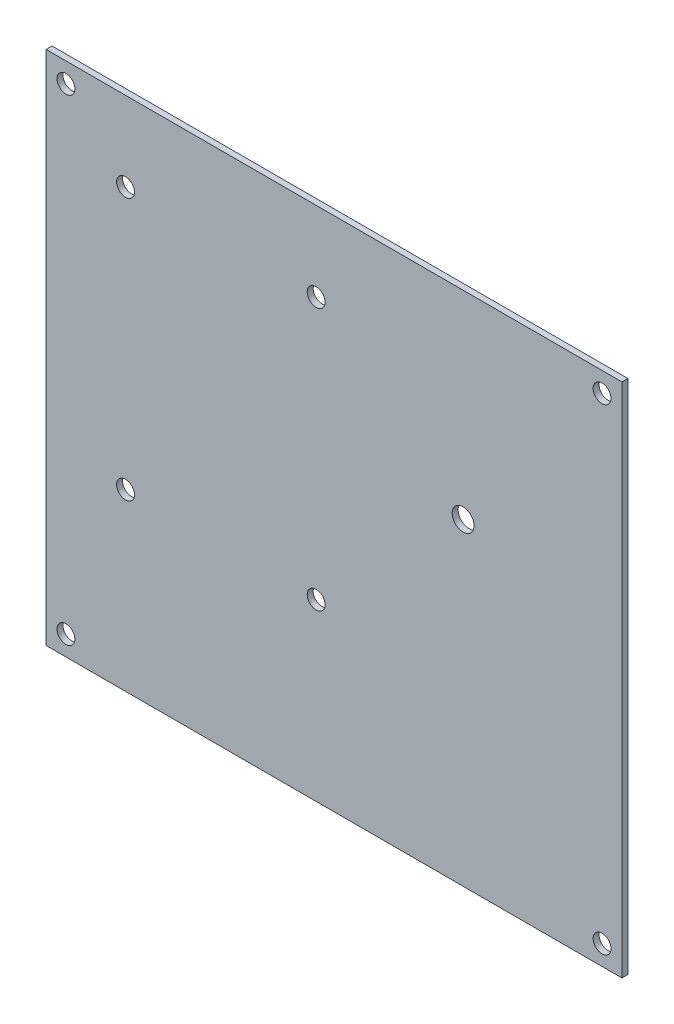
ISO-10303-21;
HEADER;
FILE_DESCRIPTION(('STEP AP214'),'2;1');
FILE_NAME('part.step','',(''),(''),'','','');
FILE_SCHEMA(('AUTOMOTIVE_DESIGN { 1 0 10303 214 1 1 1 1 }'));
ENDSEC;
DATA;
#1=APPLICATION_CONTEXT('core data for automotive mechanical design processes');
#2=APPLICATION_PROTOCOL_DEFINITION('international standard','automotive_design',2000,#1);
#3=PRODUCT_CONTEXT('',#1,'mechanical');
#4=PRODUCT('Part','Part','',(#3));
#5=PRODUCT_RELATED_PRODUCT_CATEGORY('part','',(#4));
#6=PRODUCT_DEFINITION_FORMATION('','',#4);
#7=PRODUCT_DEFINITION_CONTEXT('part definition',#1,'design');
#8=PRODUCT_DEFINITION('design','',#6,#7);
#9=PRODUCT_DEFINITION_SHAPE('','',#8);
#10=(LENGTH_UNIT() NAMED_UNIT(*) SI_UNIT(.MILLI.,.METRE.));
#11=(NAMED_UNIT(*) PLANE_ANGLE_UNIT() SI_UNIT($,.RADIAN.));
#12=(NAMED_UNIT(*) SI_UNIT($,.STERADIAN.) SOLID_ANGLE_UNIT());
#13=UNCERTAINTY_MEASURE_WITH_UNIT(LENGTH_MEASURE(1.E-05),#10,'distance_accuracy_value','');
#14=(GEOMETRIC_REPRESENTATION_CONTEXT(3) GLOBAL_UNCERTAINTY_ASSIGNED_CONTEXT((#13)) GLOBAL_UNIT_ASSIGNED_CONTEXT((#10,
#11,#12)) REPRESENTATION_CONTEXT('',''));
#15=CARTESIAN_POINT('',(0.,0.,0.));
#16=DIRECTION('',(0.,0.,1.));
#17=DIRECTION('',(1.,0.,0.));
#18=AXIS2_PLACEMENT_3D('',#15,#16,#17);
#19=CARTESIAN_POINT('',(-72.5,-65.,1.5));
#20=DIRECTION('',(0.,0.,-1.));
#21=DIRECTION('',(-1.,0.,0.));
#22=AXIS2_PLACEMENT_3D('',#19,#20,#21);
#23=PLANE('',#22);
#24=CARTESIAN_POINT('',(-4.49999999999998,-21.,1.5));
#25=DIRECTION('',(0.,0.,1.));
#26=DIRECTION('',(-1.,0.,0.));
#27=AXIS2_PLACEMENT_3D('',#24,#25,#26);
#28=CIRCLE('',#27,2.25);
#29=CARTESIAN_POINT('',(-6.74999999999997,-21.,1.5));
#30=VERTEX_POINT('',#29);
#31=EDGE_CURVE('E150',#30,#30,#28,.T.);
#32=ORIENTED_EDGE('',*,*,#31,.F.);
#33=EDGE_LOOP('',(#32));
#34=FACE_BOUND('',#33,.T.);
#35=CARTESIAN_POINT('',(-52.5,-21.,1.5));
#36=DIRECTION('',(0.,0.,1.));
#37=DIRECTION('',(-1.,0.,0.));
#38=AXIS2_PLACEMENT_3D('',#35,#36,#37);
#39=CIRCLE('',#38,2.25);
#40=CARTESIAN_POINT('',(-54.75,-21.,1.5));
#41=VERTEX_POINT('',#40);
#42=EDGE_CURVE('E138',#41,#41,#39,.T.);
#43=ORIENTED_EDGE('',*,*,#42,.F.);
#44=EDGE_LOOP('',(#43));
#45=FACE_BOUND('',#44,.T.);
#46=CARTESIAN_POINT('',(67.5,60.,1.5));
#47=DIRECTION('',(0.,0.,1.));
#48=DIRECTION('',(-1.,0.,0.));
#49=AXIS2_PLACEMENT_3D('',#46,#47,#48);
#50=CIRCLE('',#49,2.25);
#51=CARTESIAN_POINT('',(65.25,60.,1.5));
#52=VERTEX_POINT('',#51);
#53=EDGE_CURVE('E126',#52,#52,#50,.T.);
#54=ORIENTED_EDGE('',*,*,#53,.F.);
#55=EDGE_LOOP('',(#54));
#56=FACE_BOUND('',#55,.T.);
#57=CARTESIAN_POINT('',(-67.5,-60.,1.5));
#58=DIRECTION('',(0.,0.,1.));
#59=DIRECTION('',(-1.,0.,0.));
#60=AXIS2_PLACEMENT_3D('',#57,#58,#59);
#61=CIRCLE('',#60,2.25);
#62=CARTESIAN_POINT('',(-69.75,-60.,1.5));
#63=VERTEX_POINT('',#62);
#64=EDGE_CURVE('E114',#63,#63,#61,.T.);
#65=ORIENTED_EDGE('',*,*,#64,.F.);
#66=EDGE_LOOP('',(#65));
#67=FACE_BOUND('',#66,.T.);
#68=DIRECTION('',(0.,-1.,0.));
#69=VECTOR('',#68,1.);
#70=CARTESIAN_POINT('',(-72.5,-65.,1.5));
#71=LINE('',#70,#69);
#72=CARTESIAN_POINT('',(-72.5,65.,1.5));
#73=VERTEX_POINT('',#72);
#74=CARTESIAN_POINT('',(-72.5,-65.,1.5));
#75=VERTEX_POINT('',#74);
#76=EDGE_CURVE('E84',#73,#75,#71,.T.);
#77=ORIENTED_EDGE('',*,*,#76,.T.);
#78=DIRECTION('',(1.,0.,0.));
#79=VECTOR('',#78,1.);
#80=CARTESIAN_POINT('',(-72.5,-65.,1.5));
#81=LINE('',#80,#79);
#82=CARTESIAN_POINT('',(72.5,-65.,1.5));
#83=VERTEX_POINT('',#82);
#84=EDGE_CURVE('E79',#75,#83,#81,.T.);
#85=ORIENTED_EDGE('',*,*,#84,.T.);
#86=DIRECTION('',(0.,1.,0.));
#87=VECTOR('',#86,1.);
#88=CARTESIAN_POINT('',(72.5,-65.,1.5));
#89=LINE('',#88,#87);
#90=CARTESIAN_POINT('',(72.5,65.,1.5));
#91=VERTEX_POINT('',#90);
#92=EDGE_CURVE('E82',#83,#91,#89,.T.);
#93=ORIENTED_EDGE('',*,*,#92,.T.);
#94=DIRECTION('',(-1.,0.,0.));
#95=VECTOR('',#94,1.);
#96=CARTESIAN_POINT('',(-72.5,65.,1.5));
#97=LINE('',#96,#95);
#98=EDGE_CURVE('E49',#91,#73,#97,.T.);
#99=ORIENTED_EDGE('',*,*,#98,.T.);
#100=EDGE_LOOP('',(#77,#85,#93,#99));
#101=FACE_BOUND('',#100,.T.);
#102=CARTESIAN_POINT('',(-67.5,60.,1.5));
#103=DIRECTION('',(0.,0.,1.));
#104=DIRECTION('',(1.,0.,0.));
#105=AXIS2_PLACEMENT_3D('',#102,#103,#104);
#106=CIRCLE('',#105,2.25);
#107=CARTESIAN_POINT('',(-65.25,60.,1.5));
#108=VERTEX_POINT('',#107);
#109=EDGE_CURVE('E99',#108,#108,#106,.T.);
#110=ORIENTED_EDGE('',*,*,#109,.F.);
#111=EDGE_LOOP('',(#110));
#112=FACE_BOUND('',#111,.T.);
#113=CARTESIAN_POINT('',(67.5,-60.,1.5));
#114=DIRECTION('',(0.,0.,1.));
#115=DIRECTION('',(1.,0.,0.));
#116=AXIS2_PLACEMENT_3D('',#113,#114,#115);
#117=CIRCLE('',#116,2.25);
#118=CARTESIAN_POINT('',(69.75,-60.,1.5));
#119=VERTEX_POINT('',#118);
#120=EDGE_CURVE('E120',#119,#119,#117,.T.);
#121=ORIENTED_EDGE('',*,*,#120,.F.);
#122=EDGE_LOOP('',(#121));
#123=FACE_BOUND('',#122,.T.);
#124=CARTESIAN_POINT('',(-52.5,45.,1.5));
#125=DIRECTION('',(0.,0.,1.));
#126=DIRECTION('',(1.,0.,0.));
#127=AXIS2_PLACEMENT_3D('',#124,#125,#126);
#128=CIRCLE('',#127,2.25);
#129=CARTESIAN_POINT('',(-50.25,45.,1.5));
#130=VERTEX_POINT('',#129);
#131=EDGE_CURVE('E132',#130,#130,#128,.T.);
#132=ORIENTED_EDGE('',*,*,#131,.F.);
#133=EDGE_LOOP('',(#132));
#134=FACE_BOUND('',#133,.T.);
#135=CARTESIAN_POINT('',(-4.49999999999998,45.,1.5));
#136=DIRECTION('',(0.,0.,1.));
#137=DIRECTION('',(1.,0.,0.));
#138=AXIS2_PLACEMENT_3D('',#135,#136,#137);
#139=CIRCLE('',#138,2.25);
#140=CARTESIAN_POINT('',(-2.24999999999998,45.,1.5));
#141=VERTEX_POINT('',#140);
#142=EDGE_CURVE('E144',#141,#141,#139,.T.);
#143=ORIENTED_EDGE('',*,*,#142,.F.);
#144=EDGE_LOOP('',(#143));
#145=FACE_BOUND('',#144,.T.);
#146=CARTESIAN_POINT('',(32.5,15.,1.5));
#147=DIRECTION('',(0.,0.,1.));
#148=DIRECTION('',(1.,0.,0.));
#149=AXIS2_PLACEMENT_3D('',#146,#147,#148);
#150=CIRCLE('',#149,2.75);
#151=CARTESIAN_POINT('',(35.25,15.,1.5));
#152=VERTEX_POINT('',#151);
#153=EDGE_CURVE('E156',#152,#152,#150,.T.);
#154=ORIENTED_EDGE('',*,*,#153,.F.);
#155=EDGE_LOOP('',(#154));
#156=FACE_BOUND('',#155,.T.);
#157=ADVANCED_FACE('F32',(#34,#45,#56,#67,#101,#112,#123,#134,#145,#156),#23,.F.);
#158=CARTESIAN_POINT('',(-72.5,-65.,0.));
#159=DIRECTION('',(0.,0.,-1.));
#160=DIRECTION('',(-1.,0.,0.));
#161=AXIS2_PLACEMENT_3D('',#158,#159,#160);
#162=PLANE('',#161);
#163=CARTESIAN_POINT('',(-4.49999999999998,-21.,0.));
#164=DIRECTION('',(0.,0.,1.));
#165=DIRECTION('',(-1.,0.,0.));
#166=AXIS2_PLACEMENT_3D('',#163,#164,#165);
#167=CIRCLE('',#166,2.25);
#168=CARTESIAN_POINT('',(-6.74999999999997,-21.,0.));
#169=VERTEX_POINT('',#168);
#170=EDGE_CURVE('E153',#169,#169,#167,.T.);
#171=ORIENTED_EDGE('',*,*,#170,.T.);
#172=EDGE_LOOP('',(#171));
#173=FACE_BOUND('',#172,.T.);
#174=CARTESIAN_POINT('',(-52.5,-21.,0.));
#175=DIRECTION('',(0.,0.,1.));
#176=DIRECTION('',(-1.,0.,0.));
#177=AXIS2_PLACEMENT_3D('',#174,#175,#176);
#178=CIRCLE('',#177,2.25);
#179=CARTESIAN_POINT('',(-54.75,-21.,0.));
#180=VERTEX_POINT('',#179);
#181=EDGE_CURVE('E141',#180,#180,#178,.T.);
#182=ORIENTED_EDGE('',*,*,#181,.T.);
#183=EDGE_LOOP('',(#182));
#184=FACE_BOUND('',#183,.T.);
#185=CARTESIAN_POINT('',(67.5,60.,0.));
#186=DIRECTION('',(0.,0.,1.));
#187=DIRECTION('',(-1.,0.,0.));
#188=AXIS2_PLACEMENT_3D('',#185,#186,#187);
#189=CIRCLE('',#188,2.25);
#190=CARTESIAN_POINT('',(65.25,60.,0.));
#191=VERTEX_POINT('',#190);
#192=EDGE_CURVE('E129',#191,#191,#189,.T.);
#193=ORIENTED_EDGE('',*,*,#192,.T.);
#194=EDGE_LOOP('',(#193));
#195=FACE_BOUND('',#194,.T.);
#196=CARTESIAN_POINT('',(-67.5,-60.,0.));
#197=DIRECTION('',(0.,0.,1.));
#198=DIRECTION('',(-1.,0.,0.));
#199=AXIS2_PLACEMENT_3D('',#196,#197,#198);
#200=CIRCLE('',#199,2.25);
#201=CARTESIAN_POINT('',(-69.75,-60.,0.));
#202=VERTEX_POINT('',#201);
#203=EDGE_CURVE('E117',#202,#202,#200,.T.);
#204=ORIENTED_EDGE('',*,*,#203,.T.);
#205=EDGE_LOOP('',(#204));
#206=FACE_BOUND('',#205,.T.);
#207=DIRECTION('',(0.,-1.,0.));
#208=VECTOR('',#207,1.);
#209=CARTESIAN_POINT('',(-72.5,-65.,0.));
#210=LINE('',#209,#208);
#211=CARTESIAN_POINT('',(-72.5,65.,0.));
#212=VERTEX_POINT('',#211);
#213=CARTESIAN_POINT('',(-72.5,-65.,0.));
#214=VERTEX_POINT('',#213);
#215=EDGE_CURVE('E96',#212,#214,#210,.T.);
#216=ORIENTED_EDGE('',*,*,#215,.F.);
#217=DIRECTION('',(-1.,0.,0.));
#218=VECTOR('',#217,1.);
#219=CARTESIAN_POINT('',(-72.5,65.,0.));
#220=LINE('',#219,#218);
#221=CARTESIAN_POINT('',(72.5,65.,0.));
#222=VERTEX_POINT('',#221);
#223=EDGE_CURVE('E72',#222,#212,#220,.T.);
#224=ORIENTED_EDGE('',*,*,#223,.F.);
#225=DIRECTION('',(0.,1.,0.));
#226=VECTOR('',#225,1.);
#227=CARTESIAN_POINT('',(72.5,-65.,0.));
#228=LINE('',#227,#226);
#229=CARTESIAN_POINT('',(72.5,-65.,0.));
#230=VERTEX_POINT('',#229);
#231=EDGE_CURVE('E66',#230,#222,#228,.T.);
#232=ORIENTED_EDGE('',*,*,#231,.F.);
#233=DIRECTION('',(1.,0.,0.));
#234=VECTOR('',#233,1.);
#235=CARTESIAN_POINT('',(-72.5,-65.,0.));
#236=LINE('',#235,#234);
#237=EDGE_CURVE('E88',#214,#230,#236,.T.);
#238=ORIENTED_EDGE('',*,*,#237,.F.);
#239=EDGE_LOOP('',(#216,#224,#232,#238));
#240=FACE_BOUND('',#239,.T.);
#241=CARTESIAN_POINT('',(-67.5,60.,0.));
#242=DIRECTION('',(0.,0.,1.));
#243=DIRECTION('',(1.,0.,0.));
#244=AXIS2_PLACEMENT_3D('',#241,#242,#243);
#245=CIRCLE('',#244,2.25);
#246=CARTESIAN_POINT('',(-65.25,60.,0.));
#247=VERTEX_POINT('',#246);
#248=EDGE_CURVE('E111',#247,#247,#245,.T.);
#249=ORIENTED_EDGE('',*,*,#248,.T.);
#250=EDGE_LOOP('',(#249));
#251=FACE_BOUND('',#250,.T.);
#252=CARTESIAN_POINT('',(67.5,-60.,0.));
#253=DIRECTION('',(0.,0.,1.));
#254=DIRECTION('',(1.,0.,0.));
#255=AXIS2_PLACEMENT_3D('',#252,#253,#254);
#256=CIRCLE('',#255,2.25);
#257=CARTESIAN_POINT('',(69.75,-60.,0.));
#258=VERTEX_POINT('',#257);
#259=EDGE_CURVE('E123',#258,#258,#256,.T.);
#260=ORIENTED_EDGE('',*,*,#259,.T.);
#261=EDGE_LOOP('',(#260));
#262=FACE_BOUND('',#261,.T.);
#263=CARTESIAN_POINT('',(-52.5,45.,0.));
#264=DIRECTION('',(0.,0.,1.));
#265=DIRECTION('',(1.,0.,0.));
#266=AXIS2_PLACEMENT_3D('',#263,#264,#265);
#267=CIRCLE('',#266,2.25);
#268=CARTESIAN_POINT('',(-50.25,45.,0.));
#269=VERTEX_POINT('',#268);
#270=EDGE_CURVE('E135',#269,#269,#267,.T.);
#271=ORIENTED_EDGE('',*,*,#270,.T.);
#272=EDGE_LOOP('',(#271));
#273=FACE_BOUND('',#272,.T.);
#274=CARTESIAN_POINT('',(-4.49999999999998,45.,0.));
#275=DIRECTION('',(0.,0.,1.));
#276=DIRECTION('',(1.,0.,0.));
#277=AXIS2_PLACEMENT_3D('',#274,#275,#276);
#278=CIRCLE('',#277,2.25);
#279=CARTESIAN_POINT('',(-2.24999999999998,45.,0.));
#280=VERTEX_POINT('',#279);
#281=EDGE_CURVE('E147',#280,#280,#278,.T.);
#282=ORIENTED_EDGE('',*,*,#281,.T.);
#283=EDGE_LOOP('',(#282));
#284=FACE_BOUND('',#283,.T.);
#285=CARTESIAN_POINT('',(32.5,15.,0.));
#286=DIRECTION('',(0.,0.,1.));
#287=DIRECTION('',(1.,0.,0.));
#288=AXIS2_PLACEMENT_3D('',#285,#286,#287);
#289=CIRCLE('',#288,2.75);
#290=CARTESIAN_POINT('',(35.25,15.,0.));
#291=VERTEX_POINT('',#290);
#292=EDGE_CURVE('E159',#291,#291,#289,.T.);
#293=ORIENTED_EDGE('',*,*,#292,.T.);
#294=EDGE_LOOP('',(#293));
#295=FACE_BOUND('',#294,.T.);
#296=ADVANCED_FACE('F107',(#173,#184,#195,#206,#240,#251,#262,#273,#284,#295),#162,.T.);
#297=CARTESIAN_POINT('',(-72.5,-65.,1.5));
#298=DIRECTION('',(1.,0.,0.));
#299=DIRECTION('',(0.,1.,0.));
#300=AXIS2_PLACEMENT_3D('',#297,#298,#299);
#301=PLANE('',#300);
#302=ORIENTED_EDGE('',*,*,#215,.T.);
#303=DIRECTION('',(0.,0.,-1.));
#304=VECTOR('',#303,1.);
#305=CARTESIAN_POINT('',(-72.5,-65.,1.5));
#306=LINE('',#305,#304);
#307=EDGE_CURVE('E11',#75,#214,#306,.T.);
#308=ORIENTED_EDGE('',*,*,#307,.F.);
#309=ORIENTED_EDGE('',*,*,#76,.F.);
#310=DIRECTION('',(0.,0.,-1.));
#311=VECTOR('',#310,1.);
#312=CARTESIAN_POINT('',(-72.5,65.,1.5));
#313=LINE('',#312,#311);
#314=EDGE_CURVE('E92',#73,#212,#313,.T.);
#315=ORIENTED_EDGE('',*,*,#314,.T.);
#316=EDGE_LOOP('',(#302,#308,#309,#315));
#317=FACE_BOUND('',#316,.T.);
#318=ADVANCED_FACE('F34',(#317),#301,.F.);
#319=CARTESIAN_POINT('',(-72.5,-65.,1.5));
#320=DIRECTION('',(0.,1.,0.));
#321=DIRECTION('',(-1.,0.,0.));
#322=AXIS2_PLACEMENT_3D('',#319,#320,#321);
#323=PLANE('',#322);
#324=ORIENTED_EDGE('',*,*,#237,.T.);
#325=DIRECTION('',(0.,0.,-1.));
#326=VECTOR('',#325,1.);
#327=CARTESIAN_POINT('',(72.5,-65.,1.5));
#328=LINE('',#327,#326);
#329=EDGE_CURVE('E41',#83,#230,#328,.T.);
#330=ORIENTED_EDGE('',*,*,#329,.F.);
#331=ORIENTED_EDGE('',*,*,#84,.F.);
#332=ORIENTED_EDGE('',*,*,#307,.T.);
#333=EDGE_LOOP('',(#324,#330,#331,#332));
#334=FACE_BOUND('',#333,.T.);
#335=ADVANCED_FACE('F87',(#334),#323,.F.);
#336=CARTESIAN_POINT('',(72.5,-65.,1.5));
#337=DIRECTION('',(-1.,0.,0.));
#338=DIRECTION('',(0.,-1.,0.));
#339=AXIS2_PLACEMENT_3D('',#336,#337,#338);
#340=PLANE('',#339);
#341=ORIENTED_EDGE('',*,*,#231,.T.);
#342=DIRECTION('',(0.,0.,-1.));
#343=VECTOR('',#342,1.);
#344=CARTESIAN_POINT('',(72.5,65.,1.5));
#345=LINE('',#344,#343);
#346=EDGE_CURVE('E89',#91,#222,#345,.T.);
#347=ORIENTED_EDGE('',*,*,#346,.F.);
#348=ORIENTED_EDGE('',*,*,#92,.F.);
#349=ORIENTED_EDGE('',*,*,#329,.T.);
#350=EDGE_LOOP('',(#341,#347,#348,#349));
#351=FACE_BOUND('',#350,.T.);
#352=ADVANCED_FACE('F90',(#351),#340,.F.);
#353=CARTESIAN_POINT('',(-72.5,65.,1.5));
#354=DIRECTION('',(0.,-1.,0.));
#355=DIRECTION('',(0.,0.,-1.));
#356=AXIS2_PLACEMENT_3D('',#353,#354,#355);
#357=PLANE('',#356);
#358=ORIENTED_EDGE('',*,*,#223,.T.);
#359=ORIENTED_EDGE('',*,*,#314,.F.);
#360=ORIENTED_EDGE('',*,*,#98,.F.);
#361=ORIENTED_EDGE('',*,*,#346,.T.);
#362=EDGE_LOOP('',(#358,#359,#360,#361));
#363=FACE_BOUND('',#362,.T.);
#364=ADVANCED_FACE('F104',(#363),#357,.F.);
#365=CARTESIAN_POINT('',(-67.5,60.,1.5));
#366=DIRECTION('',(0.,0.,-1.));
#367=DIRECTION('',(-1.,0.,0.));
#368=AXIS2_PLACEMENT_3D('',#365,#366,#367);
#369=CYLINDRICAL_SURFACE('',#368,2.25);
#370=ORIENTED_EDGE('',*,*,#109,.T.);
#371=EDGE_LOOP('',(#370));
#372=FACE_BOUND('',#371,.T.);
#373=ORIENTED_EDGE('',*,*,#248,.F.);
#374=EDGE_LOOP('',(#373));
#375=FACE_BOUND('',#374,.T.);
#376=ADVANCED_FACE('F179',(#372,#375),#369,.F.);
#377=CARTESIAN_POINT('',(-67.5,-60.,1.5));
#378=DIRECTION('',(0.,0.,-1.));
#379=DIRECTION('',(-1.,0.,0.));
#380=AXIS2_PLACEMENT_3D('',#377,#378,#379);
#381=CYLINDRICAL_SURFACE('',#380,2.25);
#382=ORIENTED_EDGE('',*,*,#64,.T.);
#383=EDGE_LOOP('',(#382));
#384=FACE_BOUND('',#383,.T.);
#385=ORIENTED_EDGE('',*,*,#203,.F.);
#386=EDGE_LOOP('',(#385));
#387=FACE_BOUND('',#386,.T.);
#388=ADVANCED_FACE('F225',(#384,#387),#381,.F.);
#389=CARTESIAN_POINT('',(67.5,-60.,1.5));
#390=DIRECTION('',(0.,0.,-1.));
#391=DIRECTION('',(-1.,0.,0.));
#392=AXIS2_PLACEMENT_3D('',#389,#390,#391);
#393=CYLINDRICAL_SURFACE('',#392,2.25);
#394=ORIENTED_EDGE('',*,*,#120,.T.);
#395=EDGE_LOOP('',(#394));
#396=FACE_BOUND('',#395,.T.);
#397=ORIENTED_EDGE('',*,*,#259,.F.);
#398=EDGE_LOOP('',(#397));
#399=FACE_BOUND('',#398,.T.);
#400=ADVANCED_FACE('F233',(#396,#399),#393,.F.);
#401=CARTESIAN_POINT('',(67.5,60.,1.5));
#402=DIRECTION('',(0.,0.,-1.));
#403=DIRECTION('',(-1.,0.,0.));
#404=AXIS2_PLACEMENT_3D('',#401,#402,#403);
#405=CYLINDRICAL_SURFACE('',#404,2.25);
#406=ORIENTED_EDGE('',*,*,#53,.T.);
#407=EDGE_LOOP('',(#406));
#408=FACE_BOUND('',#407,.T.);
#409=ORIENTED_EDGE('',*,*,#192,.F.);
#410=EDGE_LOOP('',(#409));
#411=FACE_BOUND('',#410,.T.);
#412=ADVANCED_FACE('F241',(#408,#411),#405,.F.);
#413=CARTESIAN_POINT('',(-52.5,45.,1.5));
#414=DIRECTION('',(0.,0.,-1.));
#415=DIRECTION('',(-1.,0.,0.));
#416=AXIS2_PLACEMENT_3D('',#413,#414,#415);
#417=CYLINDRICAL_SURFACE('',#416,2.25);
#418=ORIENTED_EDGE('',*,*,#131,.T.);
#419=EDGE_LOOP('',(#418));
#420=FACE_BOUND('',#419,.T.);
#421=ORIENTED_EDGE('',*,*,#270,.F.);
#422=EDGE_LOOP('',(#421));
#423=FACE_BOUND('',#422,.T.);
#424=ADVANCED_FACE('F250',(#420,#423),#417,.F.);
#425=CARTESIAN_POINT('',(-52.5,-21.,1.5));
#426=DIRECTION('',(0.,0.,-1.));
#427=DIRECTION('',(-1.,0.,0.));
#428=AXIS2_PLACEMENT_3D('',#425,#426,#427);
#429=CYLINDRICAL_SURFACE('',#428,2.25);
#430=ORIENTED_EDGE('',*,*,#42,.T.);
#431=EDGE_LOOP('',(#430));
#432=FACE_BOUND('',#431,.T.);
#433=ORIENTED_EDGE('',*,*,#181,.F.);
#434=EDGE_LOOP('',(#433));
#435=FACE_BOUND('',#434,.T.);
#436=ADVANCED_FACE('F259',(#432,#435),#429,.F.);
#437=CARTESIAN_POINT('',(-4.49999999999998,45.,1.5));
#438=DIRECTION('',(0.,0.,-1.));
#439=DIRECTION('',(-1.,0.,0.));
#440=AXIS2_PLACEMENT_3D('',#437,#438,#439);
#441=CYLINDRICAL_SURFACE('',#440,2.25);
#442=ORIENTED_EDGE('',*,*,#142,.T.);
#443=EDGE_LOOP('',(#442));
#444=FACE_BOUND('',#443,.T.);
#445=ORIENTED_EDGE('',*,*,#281,.F.);
#446=EDGE_LOOP('',(#445));
#447=FACE_BOUND('',#446,.T.);
#448=ADVANCED_FACE('F268',(#444,#447),#441,.F.);
#449=CARTESIAN_POINT('',(-4.49999999999998,-21.,1.5));
#450=DIRECTION('',(0.,0.,-1.));
#451=DIRECTION('',(-1.,0.,0.));
#452=AXIS2_PLACEMENT_3D('',#449,#450,#451);
#453=CYLINDRICAL_SURFACE('',#452,2.25);
#454=ORIENTED_EDGE('',*,*,#31,.T.);
#455=EDGE_LOOP('',(#454));
#456=FACE_BOUND('',#455,.T.);
#457=ORIENTED_EDGE('',*,*,#170,.F.);
#458=EDGE_LOOP('',(#457));
#459=FACE_BOUND('',#458,.T.);
#460=ADVANCED_FACE('F277',(#456,#459),#453,.F.);
#461=CARTESIAN_POINT('',(32.5,15.,1.5));
#462=DIRECTION('',(0.,0.,-1.));
#463=DIRECTION('',(-1.,0.,0.));
#464=AXIS2_PLACEMENT_3D('',#461,#462,#463);
#465=CYLINDRICAL_SURFACE('',#464,2.75);
#466=ORIENTED_EDGE('',*,*,#153,.T.);
#467=EDGE_LOOP('',(#466));
#468=FACE_BOUND('',#467,.T.);
#469=ORIENTED_EDGE('',*,*,#292,.F.);
#470=EDGE_LOOP('',(#469));
#471=FACE_BOUND('',#470,.T.);
#472=ADVANCED_FACE('F165',(#468,#471),#465,.F.);
#473=CLOSED_SHELL('',(#157,#296,#318,#335,#352,#364,#376,#388,#400,#412,#424,#436,#448,#460,#472));
#474=MANIFOLD_SOLID_BREP('B2',#473);
#475=ADVANCED_BREP_SHAPE_REPRESENTATION('',(#18,#474),#14);
#476=SHAPE_DEFINITION_REPRESENTATION(#9,#475);
ENDSEC;
END-ISO-10303-21;
